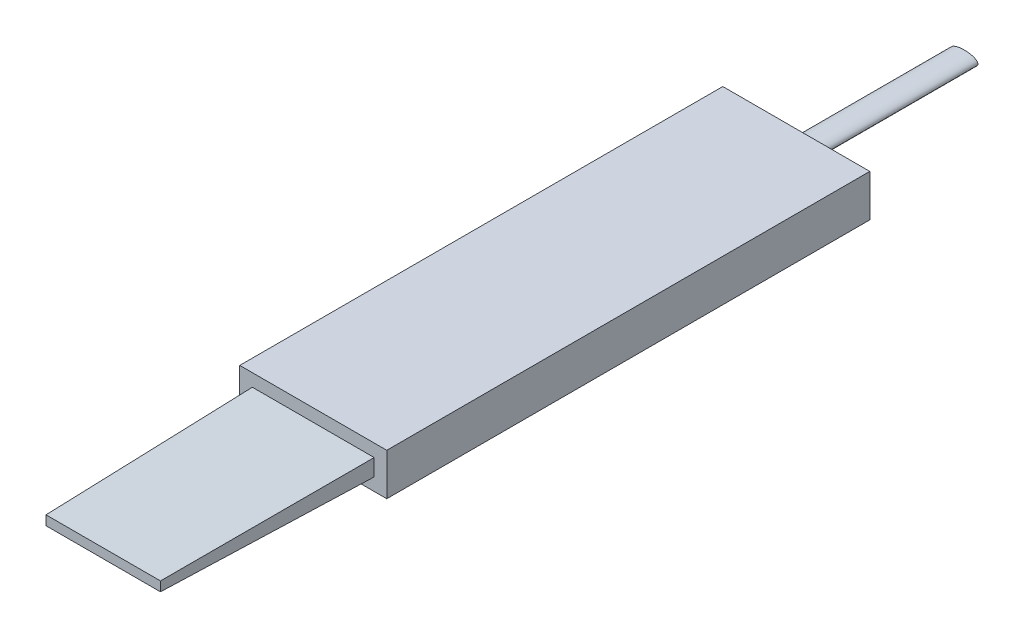
ISO-10303-21;
HEADER;
FILE_DESCRIPTION(('STEP AP214'),'2;1');
FILE_NAME('part.step','',(''),(''),'','','');
FILE_SCHEMA(('AUTOMOTIVE_DESIGN { 1 0 10303 214 1 1 1 1 }'));
ENDSEC;
DATA;
#1=APPLICATION_CONTEXT('core data for automotive mechanical design processes');
#2=APPLICATION_PROTOCOL_DEFINITION('international standard','automotive_design',2000,#1);
#3=PRODUCT_CONTEXT('',#1,'mechanical');
#4=PRODUCT('Part','Part','',(#3));
#5=PRODUCT_RELATED_PRODUCT_CATEGORY('part','',(#4));
#6=PRODUCT_DEFINITION_FORMATION('','',#4);
#7=PRODUCT_DEFINITION_CONTEXT('part definition',#1,'design');
#8=PRODUCT_DEFINITION('design','',#6,#7);
#9=PRODUCT_DEFINITION_SHAPE('','',#8);
#10=(LENGTH_UNIT() NAMED_UNIT(*) SI_UNIT(.MILLI.,.METRE.));
#11=(NAMED_UNIT(*) PLANE_ANGLE_UNIT() SI_UNIT($,.RADIAN.));
#12=(NAMED_UNIT(*) SI_UNIT($,.STERADIAN.) SOLID_ANGLE_UNIT());
#13=UNCERTAINTY_MEASURE_WITH_UNIT(LENGTH_MEASURE(1.E-05),#10,'distance_accuracy_value','');
#14=(GEOMETRIC_REPRESENTATION_CONTEXT(3) GLOBAL_UNCERTAINTY_ASSIGNED_CONTEXT((#13)) GLOBAL_UNIT_ASSIGNED_CONTEXT((#10,
#11,#12)) REPRESENTATION_CONTEXT('',''));
#15=CARTESIAN_POINT('',(0.,0.,0.));
#16=DIRECTION('',(0.,0.,1.));
#17=DIRECTION('',(1.,0.,0.));
#18=AXIS2_PLACEMENT_3D('',#15,#16,#17);
#19=CARTESIAN_POINT('',(-42.0731707317073,10.,79.5731707317073));
#20=DIRECTION('',(0.,0.,-1.));
#21=DIRECTION('',(-1.,0.,0.));
#22=AXIS2_PLACEMENT_3D('',#19,#20,#21);
#23=PLANE('',#22);
#24=DIRECTION('',(1.,0.,0.));
#25=VECTOR('',#24,1.);
#26=CARTESIAN_POINT('',(-42.0731707317073,0.,79.5731707317073));
#27=LINE('',#26,#25);
#28=CARTESIAN_POINT('',(-42.0731707317073,0.,79.5731707317073));
#29=VERTEX_POINT('',#28);
#30=CARTESIAN_POINT('',(-7.07317073170727,0.,79.5731707317073));
#31=VERTEX_POINT('',#30);
#32=EDGE_CURVE('E147',#29,#31,#27,.T.);
#33=ORIENTED_EDGE('',*,*,#32,.T.);
#34=DIRECTION('',(0.,-1.,0.));
#35=VECTOR('',#34,1.);
#36=CARTESIAN_POINT('',(-7.07317073170727,10.,79.5731707317073));
#37=LINE('',#36,#35);
#38=CARTESIAN_POINT('',(-7.07317073170727,10.,79.5731707317073));
#39=VERTEX_POINT('',#38);
#40=EDGE_CURVE('E156',#39,#31,#37,.T.);
#41=ORIENTED_EDGE('',*,*,#40,.F.);
#42=DIRECTION('',(1.,0.,0.));
#43=VECTOR('',#42,1.);
#44=CARTESIAN_POINT('',(-42.0731707317073,10.,79.5731707317073));
#45=LINE('',#44,#43);
#46=CARTESIAN_POINT('',(-42.0731707317073,10.,79.5731707317073));
#47=VERTEX_POINT('',#46);
#48=EDGE_CURVE('E137',#47,#39,#45,.T.);
#49=ORIENTED_EDGE('',*,*,#48,.F.);
#50=DIRECTION('',(0.,-1.,0.));
#51=VECTOR('',#50,1.);
#52=CARTESIAN_POINT('',(-42.0731707317073,10.,79.5731707317073));
#53=LINE('',#52,#51);
#54=EDGE_CURVE('E42',#47,#29,#53,.T.);
#55=ORIENTED_EDGE('',*,*,#54,.T.);
#56=EDGE_LOOP('',(#33,#41,#49,#55));
#57=FACE_BOUND('',#56,.T.);
#58=DIRECTION('',(0.,-1.,0.));
#59=VECTOR('',#58,1.);
#60=CARTESIAN_POINT('',(-39.0731707317073,7.,79.5731707317073));
#61=LINE('',#60,#59);
#62=CARTESIAN_POINT('',(-39.0731707317073,7.,79.5731707317073));
#63=VERTEX_POINT('',#62);
#64=CARTESIAN_POINT('',(-39.0731707317073,3.,79.5731707317073));
#65=VERTEX_POINT('',#64);
#66=EDGE_CURVE('E54',#63,#65,#61,.T.);
#67=ORIENTED_EDGE('',*,*,#66,.F.);
#68=DIRECTION('',(-1.,0.,0.));
#69=VECTOR('',#68,1.);
#70=CARTESIAN_POINT('',(-10.0731707317073,7.,79.5731707317073));
#71=LINE('',#70,#69);
#72=CARTESIAN_POINT('',(-10.0731707317073,7.,79.5731707317073));
#73=VERTEX_POINT('',#72);
#74=EDGE_CURVE('E58',#73,#63,#71,.T.);
#75=ORIENTED_EDGE('',*,*,#74,.F.);
#76=DIRECTION('',(0.,1.,0.));
#77=VECTOR('',#76,1.);
#78=CARTESIAN_POINT('',(-10.0731707317073,3.,79.5731707317073));
#79=LINE('',#78,#77);
#80=CARTESIAN_POINT('',(-10.0731707317073,3.,79.5731707317073));
#81=VERTEX_POINT('',#80);
#82=EDGE_CURVE('E99',#81,#73,#79,.T.);
#83=ORIENTED_EDGE('',*,*,#82,.F.);
#84=DIRECTION('',(1.,0.,0.));
#85=VECTOR('',#84,1.);
#86=CARTESIAN_POINT('',(-39.0731707317073,3.,79.5731707317073));
#87=LINE('',#86,#85);
#88=EDGE_CURVE('E101',#65,#81,#87,.T.);
#89=ORIENTED_EDGE('',*,*,#88,.F.);
#90=EDGE_LOOP('',(#67,#75,#83,#89));
#91=FACE_BOUND('',#90,.T.);
#92=ADVANCED_FACE('F38',(#57,#91),#23,.F.);
#93=CARTESIAN_POINT('',(-42.0731707317073,10.,-35.4268292682927));
#94=DIRECTION('',(1.,0.,0.));
#95=DIRECTION('',(0.,0.,-1.));
#96=AXIS2_PLACEMENT_3D('',#93,#94,#95);
#97=PLANE('',#96);
#98=DIRECTION('',(0.,0.,1.));
#99=VECTOR('',#98,1.);
#100=CARTESIAN_POINT('',(-42.0731707317073,0.,-35.4268292682927));
#101=LINE('',#100,#99);
#102=CARTESIAN_POINT('',(-42.0731707317073,0.,-35.4268292682927));
#103=VERTEX_POINT('',#102);
#104=EDGE_CURVE('E120',#103,#29,#101,.T.);
#105=ORIENTED_EDGE('',*,*,#104,.T.);
#106=ORIENTED_EDGE('',*,*,#54,.F.);
#107=DIRECTION('',(0.,0.,1.));
#108=VECTOR('',#107,1.);
#109=CARTESIAN_POINT('',(-42.0731707317073,10.,-35.4268292682927));
#110=LINE('',#109,#108);
#111=CARTESIAN_POINT('',(-42.0731707317073,10.,-35.4268292682927));
#112=VERTEX_POINT('',#111);
#113=EDGE_CURVE('E134',#112,#47,#110,.T.);
#114=ORIENTED_EDGE('',*,*,#113,.F.);
#115=DIRECTION('',(0.,-1.,0.));
#116=VECTOR('',#115,1.);
#117=CARTESIAN_POINT('',(-42.0731707317073,10.,-35.4268292682927));
#118=LINE('',#117,#116);
#119=EDGE_CURVE('E144',#112,#103,#118,.T.);
#120=ORIENTED_EDGE('',*,*,#119,.T.);
#121=EDGE_LOOP('',(#105,#106,#114,#120));
#122=FACE_BOUND('',#121,.T.);
#123=ADVANCED_FACE('F40',(#122),#97,.F.);
#124=CARTESIAN_POINT('',(-7.07317073170729,10.,-35.4268292682927));
#125=DIRECTION('',(-1.,0.,0.));
#126=DIRECTION('',(0.,0.,1.));
#127=AXIS2_PLACEMENT_3D('',#124,#125,#126);
#128=PLANE('',#127);
#129=DIRECTION('',(0.,0.,-1.));
#130=VECTOR('',#129,1.);
#131=CARTESIAN_POINT('',(-7.07317073170729,0.,-35.4268292682927));
#132=LINE('',#131,#130);
#133=CARTESIAN_POINT('',(-7.07317073170729,0.,-35.4268292682927));
#134=VERTEX_POINT('',#133);
#135=EDGE_CURVE('E149',#31,#134,#132,.T.);
#136=ORIENTED_EDGE('',*,*,#135,.T.);
#137=DIRECTION('',(0.,-1.,0.));
#138=VECTOR('',#137,1.);
#139=CARTESIAN_POINT('',(-7.07317073170729,10.,-35.4268292682927));
#140=LINE('',#139,#138);
#141=CARTESIAN_POINT('',(-7.07317073170729,10.,-35.4268292682927));
#142=VERTEX_POINT('',#141);
#143=EDGE_CURVE('E154',#142,#134,#140,.T.);
#144=ORIENTED_EDGE('',*,*,#143,.F.);
#145=DIRECTION('',(0.,0.,-1.));
#146=VECTOR('',#145,1.);
#147=CARTESIAN_POINT('',(-7.07317073170729,10.,-35.4268292682927));
#148=LINE('',#147,#146);
#149=EDGE_CURVE('E140',#39,#142,#148,.T.);
#150=ORIENTED_EDGE('',*,*,#149,.F.);
#151=ORIENTED_EDGE('',*,*,#40,.T.);
#152=EDGE_LOOP('',(#136,#144,#150,#151));
#153=FACE_BOUND('',#152,.T.);
#154=ADVANCED_FACE('F173',(#153),#128,.F.);
#155=CARTESIAN_POINT('',(-42.0731707317073,10.,-35.4268292682927));
#156=DIRECTION('',(0.,0.,1.));
#157=DIRECTION('',(1.,0.,0.));
#158=AXIS2_PLACEMENT_3D('',#155,#156,#157);
#159=PLANE('',#158);
#160=CARTESIAN_POINT('',(-24.5731707317073,5.,-35.4268292682927));
#161=DIRECTION('',(0.,0.,-1.));
#162=DIRECTION('',(-1.,0.,0.));
#163=AXIS2_PLACEMENT_3D('',#160,#161,#162);
#164=ELLIPSE('',#163,3.25994183811752,1.27972923397237);
#165=CARTESIAN_POINT('',(-27.8331125698248,5.,-35.4268292682927));
#166=VERTEX_POINT('',#165);
#167=EDGE_CURVE('E11',#166,#166,#164,.T.);
#168=ORIENTED_EDGE('',*,*,#167,.F.);
#169=EDGE_LOOP('',(#168));
#170=FACE_BOUND('',#169,.T.);
#171=DIRECTION('',(-1.,0.,0.));
#172=VECTOR('',#171,1.);
#173=CARTESIAN_POINT('',(-42.0731707317073,0.,-35.4268292682927));
#174=LINE('',#173,#172);
#175=EDGE_CURVE('E138',#134,#103,#174,.T.);
#176=ORIENTED_EDGE('',*,*,#175,.T.);
#177=ORIENTED_EDGE('',*,*,#119,.F.);
#178=DIRECTION('',(-1.,0.,0.));
#179=VECTOR('',#178,1.);
#180=CARTESIAN_POINT('',(-42.0731707317073,10.,-35.4268292682927));
#181=LINE('',#180,#179);
#182=EDGE_CURVE('E142',#142,#112,#181,.T.);
#183=ORIENTED_EDGE('',*,*,#182,.F.);
#184=ORIENTED_EDGE('',*,*,#143,.T.);
#185=EDGE_LOOP('',(#176,#177,#183,#184));
#186=FACE_BOUND('',#185,.T.);
#187=ADVANCED_FACE('F176',(#170,#186),#159,.F.);
#188=CARTESIAN_POINT('',(0.,10.,0.));
#189=DIRECTION('',(0.,1.,0.));
#190=DIRECTION('',(0.,0.,1.));
#191=AXIS2_PLACEMENT_3D('',#188,#189,#190);
#192=PLANE('',#191);
#193=ORIENTED_EDGE('',*,*,#113,.T.);
#194=ORIENTED_EDGE('',*,*,#48,.T.);
#195=ORIENTED_EDGE('',*,*,#149,.T.);
#196=ORIENTED_EDGE('',*,*,#182,.T.);
#197=EDGE_LOOP('',(#193,#194,#195,#196));
#198=FACE_BOUND('',#197,.T.);
#199=ADVANCED_FACE('F178',(#198),#192,.T.);
#200=CARTESIAN_POINT('',(0.,0.,0.));
#201=DIRECTION('',(0.,1.,0.));
#202=DIRECTION('',(0.,0.,1.));
#203=AXIS2_PLACEMENT_3D('',#200,#201,#202);
#204=PLANE('',#203);
#205=ORIENTED_EDGE('',*,*,#104,.F.);
#206=ORIENTED_EDGE('',*,*,#175,.F.);
#207=ORIENTED_EDGE('',*,*,#135,.F.);
#208=ORIENTED_EDGE('',*,*,#32,.F.);
#209=EDGE_LOOP('',(#205,#206,#207,#208));
#210=FACE_BOUND('',#209,.T.);
#211=ADVANCED_FACE('F171',(#210),#204,.F.);
#212=CARTESIAN_POINT('',(-39.0731707317073,7.,79.5731707317073));
#213=DIRECTION('',(-0.999847695156391,0.,0.0174524064372835));
#214=DIRECTION('',(0.0174524064372835,0.,0.999847695156391));
#215=AXIS2_PLACEMENT_3D('',#212,#213,#214);
#216=PLANE('',#215);
#217=ORIENTED_EDGE('',*,*,#66,.T.);
#218=DIRECTION('',(-0.0174497491606827,-0.0174497491606827,-0.999695459881888));
#219=VECTOR('',#218,1.);
#220=CARTESIAN_POINT('',(-39.0731707317073,3.,79.5731707317073));
#221=LINE('',#220,#219);
#222=CARTESIAN_POINT('',(-38.2004174852964,3.87275324641088,129.573170731707));
#223=VERTEX_POINT('',#222);
#224=EDGE_CURVE('E114',#223,#65,#221,.T.);
#225=ORIENTED_EDGE('',*,*,#224,.F.);
#226=DIRECTION('',(0.,1.,0.));
#227=VECTOR('',#226,1.);
#228=CARTESIAN_POINT('',(-38.2004174852964,7.,129.573170731707));
#229=LINE('',#228,#227);
#230=CARTESIAN_POINT('',(-38.2004174852964,6.12724675358912,129.573170731707));
#231=VERTEX_POINT('',#230);
#232=EDGE_CURVE('E126',#231,#223,#229,.F.);
#233=ORIENTED_EDGE('',*,*,#232,.F.);
#234=DIRECTION('',(-0.0174497491606827,0.0174497491606827,-0.999695459881888));
#235=VECTOR('',#234,1.);
#236=CARTESIAN_POINT('',(-39.0731707317073,7.,79.5731707317073));
#237=LINE('',#236,#235);
#238=EDGE_CURVE('E122',#231,#63,#237,.T.);
#239=ORIENTED_EDGE('',*,*,#238,.T.);
#240=EDGE_LOOP('',(#217,#225,#233,#239));
#241=FACE_BOUND('',#240,.T.);
#242=ADVANCED_FACE('F185',(#241),#216,.T.);
#243=CARTESIAN_POINT('',(-39.0731707317073,3.,79.5731707317073));
#244=DIRECTION('',(0.,-0.999847695156391,0.0174524064372835));
#245=DIRECTION('',(0.,-0.0174524064372836,-0.999847695156391));
#246=AXIS2_PLACEMENT_3D('',#243,#244,#245);
#247=PLANE('',#246);
#248=ORIENTED_EDGE('',*,*,#88,.T.);
#249=DIRECTION('',(0.0174497491606827,-0.0174497491606827,-0.999695459881888));
#250=VECTOR('',#249,1.);
#251=CARTESIAN_POINT('',(-10.0731707317073,3.,79.5731707317073));
#252=LINE('',#251,#250);
#253=CARTESIAN_POINT('',(-10.9459239781182,3.87275324641088,129.573170731707));
#254=VERTEX_POINT('',#253);
#255=EDGE_CURVE('E111',#254,#81,#252,.T.);
#256=ORIENTED_EDGE('',*,*,#255,.F.);
#257=DIRECTION('',(-1.,0.,0.));
#258=VECTOR('',#257,1.);
#259=CARTESIAN_POINT('',(-39.0731707317073,3.87275324641088,129.573170731707));
#260=LINE('',#259,#258);
#261=EDGE_CURVE('E129',#223,#254,#260,.F.);
#262=ORIENTED_EDGE('',*,*,#261,.F.);
#263=ORIENTED_EDGE('',*,*,#224,.T.);
#264=EDGE_LOOP('',(#248,#256,#262,#263));
#265=FACE_BOUND('',#264,.T.);
#266=ADVANCED_FACE('F110',(#265),#247,.T.);
#267=CARTESIAN_POINT('',(-10.0731707317073,3.,79.5731707317073));
#268=DIRECTION('',(0.999847695156391,0.,0.0174524064372835));
#269=DIRECTION('',(0.0174524064372835,0.,-0.999847695156391));
#270=AXIS2_PLACEMENT_3D('',#267,#268,#269);
#271=PLANE('',#270);
#272=ORIENTED_EDGE('',*,*,#82,.T.);
#273=DIRECTION('',(0.0174497491606827,0.0174497491606827,-0.999695459881888));
#274=VECTOR('',#273,1.);
#275=CARTESIAN_POINT('',(-10.0731707317073,7.,79.5731707317073));
#276=LINE('',#275,#274);
#277=CARTESIAN_POINT('',(-10.9459239781182,6.12724675358912,129.573170731707));
#278=VERTEX_POINT('',#277);
#279=EDGE_CURVE('E118',#278,#73,#276,.T.);
#280=ORIENTED_EDGE('',*,*,#279,.F.);
#281=DIRECTION('',(0.,-1.,0.));
#282=VECTOR('',#281,1.);
#283=CARTESIAN_POINT('',(-10.9459239781182,3.,129.573170731707));
#284=LINE('',#283,#282);
#285=EDGE_CURVE('E117',#254,#278,#284,.F.);
#286=ORIENTED_EDGE('',*,*,#285,.F.);
#287=ORIENTED_EDGE('',*,*,#255,.T.);
#288=EDGE_LOOP('',(#272,#280,#286,#287));
#289=FACE_BOUND('',#288,.T.);
#290=ADVANCED_FACE('F116',(#289),#271,.T.);
#291=CARTESIAN_POINT('',(-10.0731707317073,7.,79.5731707317073));
#292=DIRECTION('',(0.,0.999847695156391,0.0174524064372835));
#293=DIRECTION('',(0.,-0.0174524064372836,0.999847695156391));
#294=AXIS2_PLACEMENT_3D('',#291,#292,#293);
#295=PLANE('',#294);
#296=ORIENTED_EDGE('',*,*,#74,.T.);
#297=ORIENTED_EDGE('',*,*,#238,.F.);
#298=DIRECTION('',(1.,0.,0.));
#299=VECTOR('',#298,1.);
#300=CARTESIAN_POINT('',(-10.0731707317073,6.12724675358912,129.573170731707));
#301=LINE('',#300,#299);
#302=EDGE_CURVE('E132',#278,#231,#301,.F.);
#303=ORIENTED_EDGE('',*,*,#302,.F.);
#304=ORIENTED_EDGE('',*,*,#279,.T.);
#305=EDGE_LOOP('',(#296,#297,#303,#304));
#306=FACE_BOUND('',#305,.T.);
#307=ADVANCED_FACE('F249',(#306),#295,.T.);
#308=CARTESIAN_POINT('',(0.,0.,129.573170731707));
#309=DIRECTION('',(0.,0.,1.));
#310=DIRECTION('',(1.,0.,0.));
#311=AXIS2_PLACEMENT_3D('',#308,#309,#310);
#312=PLANE('',#311);
#313=ORIENTED_EDGE('',*,*,#232,.T.);
#314=ORIENTED_EDGE('',*,*,#261,.T.);
#315=ORIENTED_EDGE('',*,*,#285,.T.);
#316=ORIENTED_EDGE('',*,*,#302,.T.);
#317=EDGE_LOOP('',(#313,#314,#315,#316));
#318=FACE_BOUND('',#317,.T.);
#319=ADVANCED_FACE('F211',(#318),#312,.T.);
#320=CARTESIAN_POINT('',(-24.5731707317073,5.,-75.4268292682927));
#321=DIRECTION('',(0.,0.,-1.));
#322=DIRECTION('',(-1.,0.,0.));
#323=AXIS2_PLACEMENT_3D('',#320,#321,#322);
#324=ELLIPSE('',#323,3.25994183811752,1.27972923397237);
#325=DIRECTION('',(0.,0.,1.));
#326=VECTOR('',#325,1.);
#327=SURFACE_OF_LINEAR_EXTRUSION('',#324,#326);
#328=CARTESIAN_POINT('',(-27.8331125698248,5.,-75.4268292682927));
#329=VERTEX_POINT('',#328);
#330=EDGE_CURVE('E239',#329,#329,#324,.T.);
#331=ORIENTED_EDGE('',*,*,#330,.F.);
#332=EDGE_LOOP('',(#331));
#333=FACE_BOUND('',#332,.T.);
#334=ORIENTED_EDGE('',*,*,#167,.T.);
#335=EDGE_LOOP('',(#334));
#336=FACE_BOUND('',#335,.T.);
#337=ADVANCED_FACE('F216',(#333,#336),#327,.F.);
#338=CARTESIAN_POINT('',(-24.5731707317073,5.,-75.4268292682927));
#339=DIRECTION('',(0.,0.,-1.));
#340=DIRECTION('',(-1.,0.,0.));
#341=AXIS2_PLACEMENT_3D('',#338,#339,#340);
#342=PLANE('',#341);
#343=ORIENTED_EDGE('',*,*,#330,.T.);
#344=EDGE_LOOP('',(#343));
#345=FACE_BOUND('',#344,.T.);
#346=ADVANCED_FACE('F221',(#345),#342,.T.);
#347=CLOSED_SHELL('',(#92,#123,#154,#187,#199,#211,#242,#266,#290,#307,#319,#337,#346));
#348=MANIFOLD_SOLID_BREP('B2',#347);
#349=ADVANCED_BREP_SHAPE_REPRESENTATION('',(#18,#348),#14);
#350=SHAPE_DEFINITION_REPRESENTATION(#9,#349);
ENDSEC;
END-ISO-10303-21;
